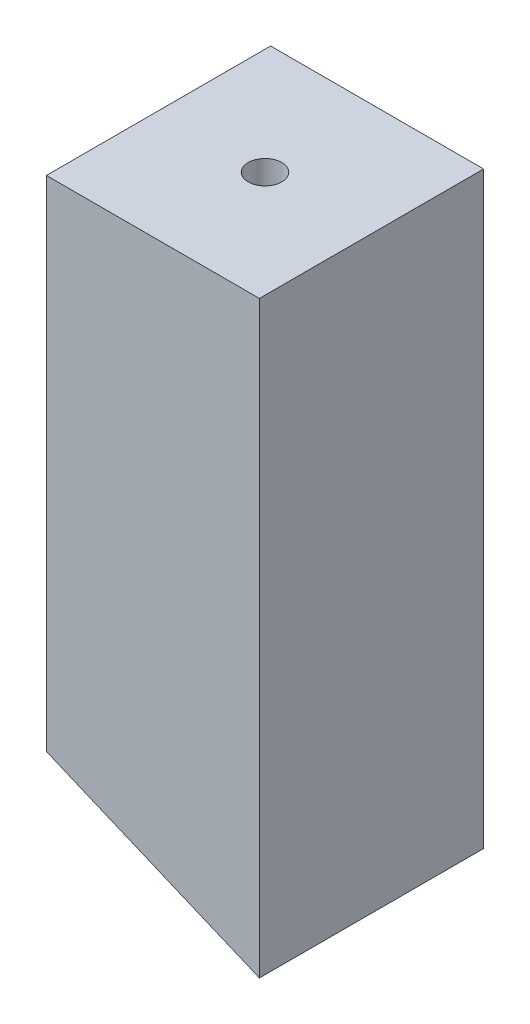
ISO-10303-21;
HEADER;
FILE_DESCRIPTION(('STEP AP214'),'2;1');
FILE_NAME('part.step','',(''),(''),'','','');
FILE_SCHEMA(('AUTOMOTIVE_DESIGN { 1 0 10303 214 1 1 1 1 }'));
ENDSEC;
DATA;
#1=APPLICATION_CONTEXT('core data for automotive mechanical design processes');
#2=APPLICATION_PROTOCOL_DEFINITION('international standard','automotive_design',2000,#1);
#3=PRODUCT_CONTEXT('',#1,'mechanical');
#4=PRODUCT('Part','Part','',(#3));
#5=PRODUCT_RELATED_PRODUCT_CATEGORY('part','',(#4));
#6=PRODUCT_DEFINITION_FORMATION('','',#4);
#7=PRODUCT_DEFINITION_CONTEXT('part definition',#1,'design');
#8=PRODUCT_DEFINITION('design','',#6,#7);
#9=PRODUCT_DEFINITION_SHAPE('','',#8);
#10=(LENGTH_UNIT() NAMED_UNIT(*) SI_UNIT(.MILLI.,.METRE.));
#11=(NAMED_UNIT(*) PLANE_ANGLE_UNIT() SI_UNIT($,.RADIAN.));
#12=(NAMED_UNIT(*) SI_UNIT($,.STERADIAN.) SOLID_ANGLE_UNIT());
#13=UNCERTAINTY_MEASURE_WITH_UNIT(LENGTH_MEASURE(1.E-05),#10,'distance_accuracy_value','');
#14=(GEOMETRIC_REPRESENTATION_CONTEXT(3) GLOBAL_UNCERTAINTY_ASSIGNED_CONTEXT((#13)) GLOBAL_UNIT_ASSIGNED_CONTEXT((#10,
#11,#12)) REPRESENTATION_CONTEXT('',''));
#15=CARTESIAN_POINT('',(0.,0.,0.));
#16=DIRECTION('',(0.,0.,1.));
#17=DIRECTION('',(1.,0.,0.));
#18=AXIS2_PLACEMENT_3D('',#15,#16,#17);
#19=CARTESIAN_POINT('',(29.5000000000617,3.99999999988691,-20.));
#20=DIRECTION('',(1.,0.,0.));
#21=DIRECTION('',(0.,0.,-1.));
#22=AXIS2_PLACEMENT_3D('',#19,#20,#21);
#23=PLANE('',#22);
#24=DIRECTION('',(0.,1.,0.));
#25=VECTOR('',#24,1.);
#26=CARTESIAN_POINT('',(29.5000000000617,3.99999999988691,0.));
#27=LINE('',#26,#25);
#28=CARTESIAN_POINT('',(29.5000000000617,3.99999999988691,0.));
#29=VERTEX_POINT('',#28);
#30=CARTESIAN_POINT('',(29.5000000000617,56.4999999998869,0.));
#31=VERTEX_POINT('',#30);
#32=EDGE_CURVE('E102',#29,#31,#27,.T.);
#33=ORIENTED_EDGE('',*,*,#32,.F.);
#34=DIRECTION('',(0.,0.,1.));
#35=VECTOR('',#34,1.);
#36=CARTESIAN_POINT('',(29.5000000000617,3.99999999988691,-20.));
#37=LINE('',#36,#35);
#38=CARTESIAN_POINT('',(29.5000000000617,3.99999999988691,-20.));
#39=VERTEX_POINT('',#38);
#40=EDGE_CURVE('E11',#39,#29,#37,.T.);
#41=ORIENTED_EDGE('',*,*,#40,.F.);
#42=DIRECTION('',(0.,1.,0.));
#43=VECTOR('',#42,1.);
#44=CARTESIAN_POINT('',(29.5000000000617,3.99999999988691,-20.));
#45=LINE('',#44,#43);
#46=CARTESIAN_POINT('',(29.5000000000617,56.4999999998869,-20.));
#47=VERTEX_POINT('',#46);
#48=EDGE_CURVE('E95',#39,#47,#45,.T.);
#49=ORIENTED_EDGE('',*,*,#48,.T.);
#50=DIRECTION('',(0.,0.,1.));
#51=VECTOR('',#50,1.);
#52=CARTESIAN_POINT('',(29.5000000000617,56.4999999998869,-20.));
#53=LINE('',#52,#51);
#54=EDGE_CURVE('E40',#47,#31,#53,.T.);
#55=ORIENTED_EDGE('',*,*,#54,.T.);
#56=EDGE_LOOP('',(#33,#41,#49,#55));
#57=FACE_BOUND('',#56,.T.);
#58=ADVANCED_FACE('F37',(#57),#23,.T.);
#59=CARTESIAN_POINT('',(10.5000000000617,11.9999999998869,-20.));
#60=DIRECTION('',(-0.388057000058133,-0.921635375138065,0.));
#61=DIRECTION('',(0.921635375138065,-0.388057000058133,0.));
#62=AXIS2_PLACEMENT_3D('',#59,#60,#61);
#63=PLANE('',#62);
#64=DIRECTION('',(0.921635375138065,-0.388057000058133,0.));
#65=VECTOR('',#64,1.);
#66=CARTESIAN_POINT('',(10.5000000000617,11.9999999998869,0.));
#67=LINE('',#66,#65);
#68=CARTESIAN_POINT('',(10.5000000000617,11.9999999998869,0.));
#69=VERTEX_POINT('',#68);
#70=EDGE_CURVE('E97',#69,#29,#67,.T.);
#71=ORIENTED_EDGE('',*,*,#70,.F.);
#72=DIRECTION('',(0.,0.,1.));
#73=VECTOR('',#72,1.);
#74=CARTESIAN_POINT('',(10.5000000000617,11.9999999998869,-20.));
#75=LINE('',#74,#73);
#76=CARTESIAN_POINT('',(10.5000000000617,11.9999999998869,-20.));
#77=VERTEX_POINT('',#76);
#78=EDGE_CURVE('E46',#77,#69,#75,.T.);
#79=ORIENTED_EDGE('',*,*,#78,.F.);
#80=DIRECTION('',(0.921635375138065,-0.388057000058133,0.));
#81=VECTOR('',#80,1.);
#82=CARTESIAN_POINT('',(10.5000000000617,11.9999999998869,-20.));
#83=LINE('',#82,#81);
#84=EDGE_CURVE('E92',#77,#39,#83,.T.);
#85=ORIENTED_EDGE('',*,*,#84,.T.);
#86=ORIENTED_EDGE('',*,*,#40,.T.);
#87=EDGE_LOOP('',(#71,#79,#85,#86));
#88=FACE_BOUND('',#87,.T.);
#89=ADVANCED_FACE('F113',(#88),#63,.T.);
#90=CARTESIAN_POINT('',(10.5000000000617,11.9999999998869,-20.));
#91=DIRECTION('',(-1.,0.,0.));
#92=DIRECTION('',(0.,0.,1.));
#93=AXIS2_PLACEMENT_3D('',#90,#91,#92);
#94=PLANE('',#93);
#95=DIRECTION('',(0.,-1.,0.));
#96=VECTOR('',#95,1.);
#97=CARTESIAN_POINT('',(10.5000000000617,11.9999999998869,0.));
#98=LINE('',#97,#96);
#99=CARTESIAN_POINT('',(10.5000000000617,56.4999999998869,0.));
#100=VERTEX_POINT('',#99);
#101=EDGE_CURVE('E87',#100,#69,#98,.T.);
#102=ORIENTED_EDGE('',*,*,#101,.F.);
#103=DIRECTION('',(0.,0.,1.));
#104=VECTOR('',#103,1.);
#105=CARTESIAN_POINT('',(10.5000000000617,56.4999999998869,-20.));
#106=LINE('',#105,#104);
#107=CARTESIAN_POINT('',(10.5000000000617,56.4999999998869,-20.));
#108=VERTEX_POINT('',#107);
#109=EDGE_CURVE('E82',#108,#100,#106,.T.);
#110=ORIENTED_EDGE('',*,*,#109,.F.);
#111=DIRECTION('',(0.,-1.,0.));
#112=VECTOR('',#111,1.);
#113=CARTESIAN_POINT('',(10.5000000000617,11.9999999998869,-20.));
#114=LINE('',#113,#112);
#115=EDGE_CURVE('E85',#108,#77,#114,.T.);
#116=ORIENTED_EDGE('',*,*,#115,.T.);
#117=ORIENTED_EDGE('',*,*,#78,.T.);
#118=EDGE_LOOP('',(#102,#110,#116,#117));
#119=FACE_BOUND('',#118,.T.);
#120=ADVANCED_FACE('F84',(#119),#94,.T.);
#121=CARTESIAN_POINT('',(10.5000000000617,56.4999999998869,-20.));
#122=DIRECTION('',(0.,1.,0.));
#123=DIRECTION('',(0.,0.,1.));
#124=AXIS2_PLACEMENT_3D('',#121,#122,#123);
#125=PLANE('',#124);
#126=CARTESIAN_POINT('',(20.0000000000617,56.4999999998869,-10.));
#127=DIRECTION('',(0.,1.,0.));
#128=DIRECTION('',(0.,0.,1.));
#129=AXIS2_PLACEMENT_3D('',#126,#127,#128);
#130=CIRCLE('',#129,1.5);
#131=CARTESIAN_POINT('',(20.0000000000617,56.4999999998869,-8.5));
#132=VERTEX_POINT('',#131);
#133=EDGE_CURVE('E130',#132,#132,#130,.T.);
#134=ORIENTED_EDGE('',*,*,#133,.F.);
#135=EDGE_LOOP('',(#134));
#136=FACE_BOUND('',#135,.T.);
#137=DIRECTION('',(-1.,0.,0.));
#138=VECTOR('',#137,1.);
#139=CARTESIAN_POINT('',(10.5000000000617,56.4999999998869,0.));
#140=LINE('',#139,#138);
#141=EDGE_CURVE('E105',#31,#100,#140,.T.);
#142=ORIENTED_EDGE('',*,*,#141,.F.);
#143=ORIENTED_EDGE('',*,*,#54,.F.);
#144=DIRECTION('',(-1.,0.,0.));
#145=VECTOR('',#144,1.);
#146=CARTESIAN_POINT('',(10.5000000000617,56.4999999998869,-20.));
#147=LINE('',#146,#145);
#148=EDGE_CURVE('E91',#47,#108,#147,.T.);
#149=ORIENTED_EDGE('',*,*,#148,.T.);
#150=ORIENTED_EDGE('',*,*,#109,.T.);
#151=EDGE_LOOP('',(#142,#143,#149,#150));
#152=FACE_BOUND('',#151,.T.);
#153=ADVANCED_FACE('F94',(#136,#152),#125,.T.);
#154=CARTESIAN_POINT('',(0.,0.,-20.));
#155=DIRECTION('',(0.,0.,-1.));
#156=DIRECTION('',(-1.,0.,0.));
#157=AXIS2_PLACEMENT_3D('',#154,#155,#156);
#158=PLANE('',#157);
#159=ORIENTED_EDGE('',*,*,#48,.F.);
#160=ORIENTED_EDGE('',*,*,#84,.F.);
#161=ORIENTED_EDGE('',*,*,#115,.F.);
#162=ORIENTED_EDGE('',*,*,#148,.F.);
#163=EDGE_LOOP('',(#159,#160,#161,#162));
#164=FACE_BOUND('',#163,.T.);
#165=ADVANCED_FACE('F90',(#164),#158,.T.);
#166=CARTESIAN_POINT('',(0.,0.,0.));
#167=DIRECTION('',(0.,0.,-1.));
#168=DIRECTION('',(-1.,0.,0.));
#169=AXIS2_PLACEMENT_3D('',#166,#167,#168);
#170=PLANE('',#169);
#171=ORIENTED_EDGE('',*,*,#32,.T.);
#172=ORIENTED_EDGE('',*,*,#141,.T.);
#173=ORIENTED_EDGE('',*,*,#101,.T.);
#174=ORIENTED_EDGE('',*,*,#70,.T.);
#175=EDGE_LOOP('',(#171,#172,#173,#174));
#176=FACE_BOUND('',#175,.T.);
#177=ADVANCED_FACE('F112',(#176),#170,.F.);
#178=CARTESIAN_POINT('',(20.0000000000617,36.4999999998869,-10.));
#179=DIRECTION('',(0.,1.,0.));
#180=DIRECTION('',(0.,0.,1.));
#181=AXIS2_PLACEMENT_3D('',#178,#179,#180);
#182=CYLINDRICAL_SURFACE('',#181,1.5);
#183=CARTESIAN_POINT('',(20.0000000000617,36.4999999998869,-10.));
#184=DIRECTION('',(0.,1.,0.));
#185=DIRECTION('',(0.,0.,1.));
#186=AXIS2_PLACEMENT_3D('',#183,#184,#185);
#187=CIRCLE('',#186,1.5);
#188=CARTESIAN_POINT('',(20.0000000000617,36.4999999998869,-8.5));
#189=VERTEX_POINT('',#188);
#190=EDGE_CURVE('E106',#189,#189,#187,.T.);
#191=ORIENTED_EDGE('',*,*,#190,.F.);
#192=EDGE_LOOP('',(#191));
#193=FACE_BOUND('',#192,.T.);
#194=ORIENTED_EDGE('',*,*,#133,.T.);
#195=EDGE_LOOP('',(#194));
#196=FACE_BOUND('',#195,.T.);
#197=ADVANCED_FACE('F138',(#193,#196),#182,.F.);
#198=CARTESIAN_POINT('',(20.0000000000617,36.4999999998869,-10.));
#199=DIRECTION('',(0.,1.,0.));
#200=DIRECTION('',(0.,0.,1.));
#201=AXIS2_PLACEMENT_3D('',#198,#199,#200);
#202=PLANE('',#201);
#203=ORIENTED_EDGE('',*,*,#190,.T.);
#204=EDGE_LOOP('',(#203));
#205=FACE_BOUND('',#204,.T.);
#206=ADVANCED_FACE('F136',(#205),#202,.T.);
#207=CLOSED_SHELL('',(#58,#89,#120,#153,#165,#177,#197,#206));
#208=MANIFOLD_SOLID_BREP('B2',#207);
#209=ADVANCED_BREP_SHAPE_REPRESENTATION('',(#18,#208),#14);
#210=SHAPE_DEFINITION_REPRESENTATION(#9,#209);
ENDSEC;
END-ISO-10303-21;
